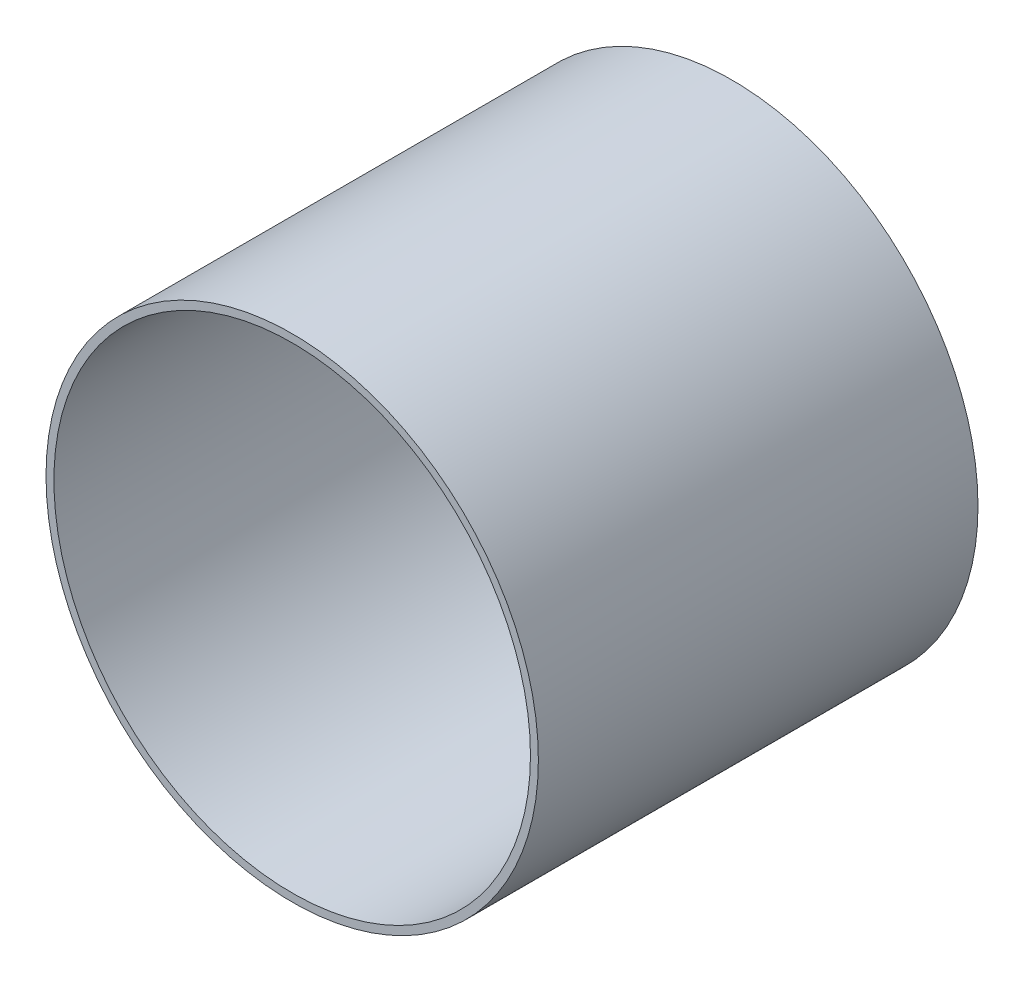
ISO-10303-21;
HEADER;
FILE_DESCRIPTION(('STEP AP214'),'2;1');
FILE_NAME('part.step','',(''),(''),'','','');
FILE_SCHEMA(('AUTOMOTIVE_DESIGN { 1 0 10303 214 1 1 1 1 }'));
ENDSEC;
DATA;
#1=APPLICATION_CONTEXT('core data for automotive mechanical design processes');
#2=APPLICATION_PROTOCOL_DEFINITION('international standard','automotive_design',2000,#1);
#3=PRODUCT_CONTEXT('',#1,'mechanical');
#4=PRODUCT('Part','Part','',(#3));
#5=PRODUCT_RELATED_PRODUCT_CATEGORY('part','',(#4));
#6=PRODUCT_DEFINITION_FORMATION('','',#4);
#7=PRODUCT_DEFINITION_CONTEXT('part definition',#1,'design');
#8=PRODUCT_DEFINITION('design','',#6,#7);
#9=PRODUCT_DEFINITION_SHAPE('','',#8);
#10=(LENGTH_UNIT() NAMED_UNIT(*) SI_UNIT(.MILLI.,.METRE.));
#11=(NAMED_UNIT(*) PLANE_ANGLE_UNIT() SI_UNIT($,.RADIAN.));
#12=(NAMED_UNIT(*) SI_UNIT($,.STERADIAN.) SOLID_ANGLE_UNIT());
#13=UNCERTAINTY_MEASURE_WITH_UNIT(LENGTH_MEASURE(1.E-05),#10,'distance_accuracy_value','');
#14=(GEOMETRIC_REPRESENTATION_CONTEXT(3) GLOBAL_UNCERTAINTY_ASSIGNED_CONTEXT((#13)) GLOBAL_UNIT_ASSIGNED_CONTEXT((#10,
#11,#12)) REPRESENTATION_CONTEXT('',''));
#15=CARTESIAN_POINT('',(0.,0.,0.));
#16=DIRECTION('',(0.,0.,1.));
#17=DIRECTION('',(1.,0.,0.));
#18=AXIS2_PLACEMENT_3D('',#15,#16,#17);
#19=CARTESIAN_POINT('',(0.,0.,25.));
#20=DIRECTION('',(0.,0.,1.));
#21=DIRECTION('',(1.,0.,0.));
#22=AXIS2_PLACEMENT_3D('',#19,#20,#21);
#23=PLANE('',#22);
#24=CARTESIAN_POINT('',(0.,0.,25.));
#25=DIRECTION('',(0.,0.,1.));
#26=DIRECTION('',(1.,0.,0.));
#27=AXIS2_PLACEMENT_3D('',#24,#25,#26);
#28=CIRCLE('',#27,14.);
#29=CARTESIAN_POINT('',(14.,0.,25.));
#30=VERTEX_POINT('',#29);
#31=EDGE_CURVE('E10',#30,#30,#28,.T.);
#32=ORIENTED_EDGE('',*,*,#31,.T.);
#33=EDGE_LOOP('',(#32));
#34=FACE_BOUND('',#33,.T.);
#35=CARTESIAN_POINT('',(0.,0.,25.));
#36=DIRECTION('',(0.,0.,1.));
#37=DIRECTION('',(1.,0.,0.));
#38=AXIS2_PLACEMENT_3D('',#35,#36,#37);
#39=CIRCLE('',#38,13.55);
#40=CARTESIAN_POINT('',(13.55,0.,25.));
#41=VERTEX_POINT('',#40);
#42=EDGE_CURVE('E42',#41,#41,#39,.T.);
#43=ORIENTED_EDGE('',*,*,#42,.F.);
#44=EDGE_LOOP('',(#43));
#45=FACE_BOUND('',#44,.T.);
#46=ADVANCED_FACE('F31',(#34,#45),#23,.T.);
#47=CARTESIAN_POINT('',(0.,0.,0.));
#48=DIRECTION('',(0.,0.,1.));
#49=DIRECTION('',(1.,0.,0.));
#50=AXIS2_PLACEMENT_3D('',#47,#48,#49);
#51=PLANE('',#50);
#52=CARTESIAN_POINT('',(0.,0.,0.));
#53=DIRECTION('',(0.,0.,1.));
#54=DIRECTION('',(1.,0.,0.));
#55=AXIS2_PLACEMENT_3D('',#52,#53,#54);
#56=CIRCLE('',#55,14.);
#57=CARTESIAN_POINT('',(14.,0.,0.));
#58=VERTEX_POINT('',#57);
#59=EDGE_CURVE('E35',#58,#58,#56,.T.);
#60=ORIENTED_EDGE('',*,*,#59,.F.);
#61=EDGE_LOOP('',(#60));
#62=FACE_BOUND('',#61,.T.);
#63=CARTESIAN_POINT('',(0.,0.,0.));
#64=DIRECTION('',(0.,0.,1.));
#65=DIRECTION('',(1.,0.,0.));
#66=AXIS2_PLACEMENT_3D('',#63,#64,#65);
#67=CIRCLE('',#66,13.55);
#68=CARTESIAN_POINT('',(13.55,0.,0.));
#69=VERTEX_POINT('',#68);
#70=EDGE_CURVE('E44',#69,#69,#67,.T.);
#71=ORIENTED_EDGE('',*,*,#70,.T.);
#72=EDGE_LOOP('',(#71));
#73=FACE_BOUND('',#72,.T.);
#74=ADVANCED_FACE('F54',(#62,#73),#51,.F.);
#75=CARTESIAN_POINT('',(0.,0.,25.));
#76=DIRECTION('',(0.,0.,-1.));
#77=DIRECTION('',(-1.,0.,0.));
#78=AXIS2_PLACEMENT_3D('',#75,#76,#77);
#79=CYLINDRICAL_SURFACE('',#78,14.);
#80=ORIENTED_EDGE('',*,*,#31,.F.);
#81=EDGE_LOOP('',(#80));
#82=FACE_BOUND('',#81,.T.);
#83=ORIENTED_EDGE('',*,*,#59,.T.);
#84=EDGE_LOOP('',(#83));
#85=FACE_BOUND('',#84,.T.);
#86=ADVANCED_FACE('F33',(#82,#85),#79,.T.);
#87=CARTESIAN_POINT('',(0.,0.,25.));
#88=DIRECTION('',(0.,0.,-1.));
#89=DIRECTION('',(-1.,0.,0.));
#90=AXIS2_PLACEMENT_3D('',#87,#88,#89);
#91=CYLINDRICAL_SURFACE('',#90,13.55);
#92=ORIENTED_EDGE('',*,*,#42,.T.);
#93=EDGE_LOOP('',(#92));
#94=FACE_BOUND('',#93,.T.);
#95=ORIENTED_EDGE('',*,*,#70,.F.);
#96=EDGE_LOOP('',(#95));
#97=FACE_BOUND('',#96,.T.);
#98=ADVANCED_FACE('F50',(#94,#97),#91,.F.);
#99=CLOSED_SHELL('',(#46,#74,#86,#98));
#100=MANIFOLD_SOLID_BREP('B2',#99);
#101=ADVANCED_BREP_SHAPE_REPRESENTATION('',(#18,#100),#14);
#102=SHAPE_DEFINITION_REPRESENTATION(#9,#101);
ENDSEC;
END-ISO-10303-21;
